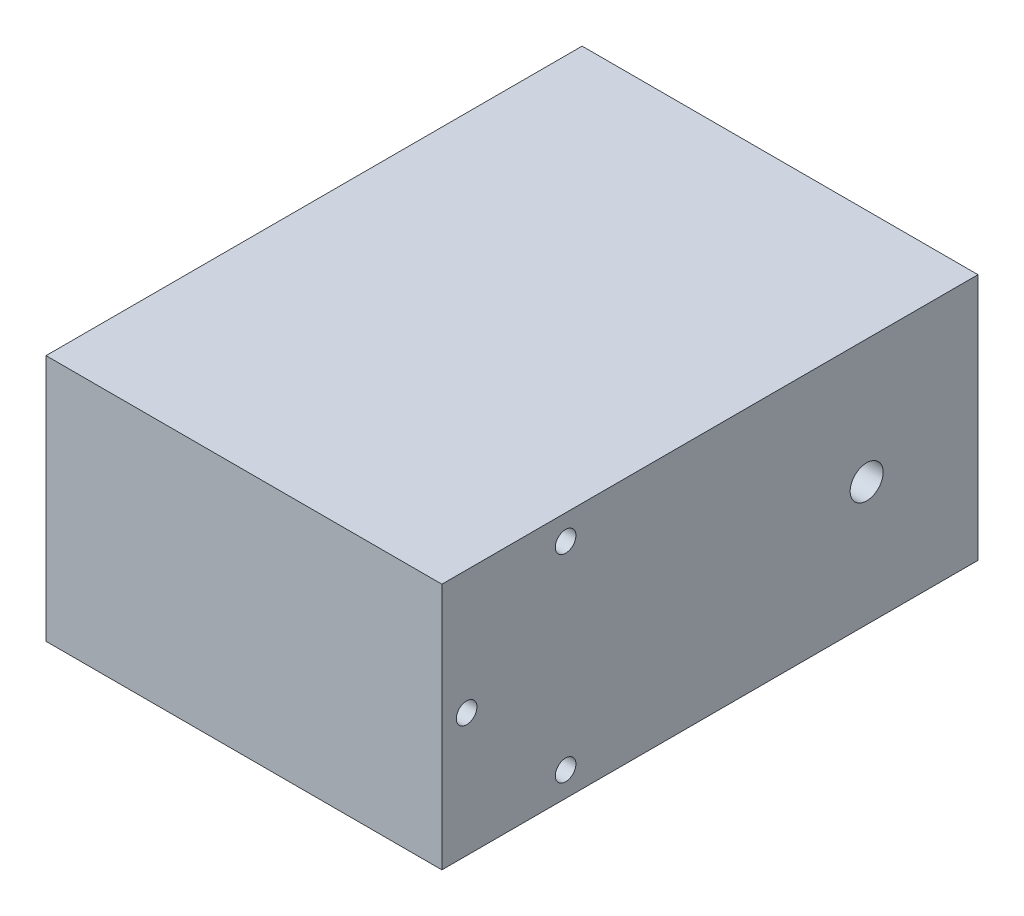
ISO-10303-21;
HEADER;
FILE_DESCRIPTION(('STEP AP214'),'2;1');
FILE_NAME('part.step','',(''),(''),'','','');
FILE_SCHEMA(('AUTOMOTIVE_DESIGN { 1 0 10303 214 1 1 1 1 }'));
ENDSEC;
DATA;
#1=APPLICATION_CONTEXT('core data for automotive mechanical design processes');
#2=APPLICATION_PROTOCOL_DEFINITION('international standard','automotive_design',2000,#1);
#3=PRODUCT_CONTEXT('',#1,'mechanical');
#4=PRODUCT('Part','Part','',(#3));
#5=PRODUCT_RELATED_PRODUCT_CATEGORY('part','',(#4));
#6=PRODUCT_DEFINITION_FORMATION('','',#4);
#7=PRODUCT_DEFINITION_CONTEXT('part definition',#1,'design');
#8=PRODUCT_DEFINITION('design','',#6,#7);
#9=PRODUCT_DEFINITION_SHAPE('','',#8);
#10=(LENGTH_UNIT() NAMED_UNIT(*) SI_UNIT(.MILLI.,.METRE.));
#11=(NAMED_UNIT(*) PLANE_ANGLE_UNIT() SI_UNIT($,.RADIAN.));
#12=(NAMED_UNIT(*) SI_UNIT($,.STERADIAN.) SOLID_ANGLE_UNIT());
#13=UNCERTAINTY_MEASURE_WITH_UNIT(LENGTH_MEASURE(1.E-05),#10,'distance_accuracy_value','');
#14=(GEOMETRIC_REPRESENTATION_CONTEXT(3) GLOBAL_UNCERTAINTY_ASSIGNED_CONTEXT((#13)) GLOBAL_UNIT_ASSIGNED_CONTEXT((#10,
#11,#12)) REPRESENTATION_CONTEXT('',''));
#15=CARTESIAN_POINT('',(0.,0.,0.));
#16=DIRECTION('',(0.,0.,1.));
#17=DIRECTION('',(1.,0.,0.));
#18=AXIS2_PLACEMENT_3D('',#15,#16,#17);
#19=CARTESIAN_POINT('',(48.,0.,0.));
#20=DIRECTION('',(0.,0.,-1.));
#21=DIRECTION('',(0.,1.,0.));
#22=AXIS2_PLACEMENT_3D('',#19,#20,#21);
#23=PLANE('',#22);
#24=DIRECTION('',(0.,-1.,0.));
#25=VECTOR('',#24,1.);
#26=CARTESIAN_POINT('',(0.,0.,0.));
#27=LINE('',#26,#25);
#28=CARTESIAN_POINT('',(0.,30.,0.));
#29=VERTEX_POINT('',#28);
#30=CARTESIAN_POINT('',(0.,0.,0.));
#31=VERTEX_POINT('',#30);
#32=EDGE_CURVE('E80',#29,#31,#27,.T.);
#33=ORIENTED_EDGE('',*,*,#32,.T.);
#34=DIRECTION('',(-1.,0.,0.));
#35=VECTOR('',#34,1.);
#36=CARTESIAN_POINT('',(48.,0.,0.));
#37=LINE('',#36,#35);
#38=CARTESIAN_POINT('',(48.,0.,0.));
#39=VERTEX_POINT('',#38);
#40=EDGE_CURVE('E11',#39,#31,#37,.T.);
#41=ORIENTED_EDGE('',*,*,#40,.F.);
#42=DIRECTION('',(0.,-1.,0.));
#43=VECTOR('',#42,1.);
#44=CARTESIAN_POINT('',(48.,0.,0.));
#45=LINE('',#44,#43);
#46=CARTESIAN_POINT('',(48.,30.,0.));
#47=VERTEX_POINT('',#46);
#48=EDGE_CURVE('E68',#47,#39,#45,.T.);
#49=ORIENTED_EDGE('',*,*,#48,.F.);
#50=DIRECTION('',(-1.,0.,0.));
#51=VECTOR('',#50,1.);
#52=CARTESIAN_POINT('',(48.,30.,0.));
#53=LINE('',#52,#51);
#54=EDGE_CURVE('E76',#47,#29,#53,.T.);
#55=ORIENTED_EDGE('',*,*,#54,.T.);
#56=EDGE_LOOP('',(#33,#41,#49,#55));
#57=FACE_BOUND('',#56,.T.);
#58=ADVANCED_FACE('F17',(#57),#23,.F.);
#59=CARTESIAN_POINT('',(48.,0.,0.));
#60=DIRECTION('',(0.,1.,0.));
#61=DIRECTION('',(0.,0.,1.));
#62=AXIS2_PLACEMENT_3D('',#59,#60,#61);
#63=PLANE('',#62);
#64=DIRECTION('',(0.,0.,-1.));
#65=VECTOR('',#64,1.);
#66=CARTESIAN_POINT('',(0.,0.,0.));
#67=LINE('',#66,#65);
#68=CARTESIAN_POINT('',(0.,0.,-65.));
#69=VERTEX_POINT('',#68);
#70=EDGE_CURVE('E72',#31,#69,#67,.T.);
#71=ORIENTED_EDGE('',*,*,#70,.T.);
#72=DIRECTION('',(-1.,0.,0.));
#73=VECTOR('',#72,1.);
#74=CARTESIAN_POINT('',(48.,0.,-65.));
#75=LINE('',#74,#73);
#76=CARTESIAN_POINT('',(48.,0.,-65.));
#77=VERTEX_POINT('',#76);
#78=EDGE_CURVE('E25',#77,#69,#75,.T.);
#79=ORIENTED_EDGE('',*,*,#78,.F.);
#80=DIRECTION('',(0.,0.,-1.));
#81=VECTOR('',#80,1.);
#82=CARTESIAN_POINT('',(48.,0.,0.));
#83=LINE('',#82,#81);
#84=EDGE_CURVE('E63',#39,#77,#83,.T.);
#85=ORIENTED_EDGE('',*,*,#84,.F.);
#86=ORIENTED_EDGE('',*,*,#40,.T.);
#87=EDGE_LOOP('',(#71,#79,#85,#86));
#88=FACE_BOUND('',#87,.T.);
#89=ADVANCED_FACE('F71',(#88),#63,.F.);
#90=CARTESIAN_POINT('',(48.,0.,-65.));
#91=DIRECTION('',(0.,0.,1.));
#92=DIRECTION('',(0.,-1.,0.));
#93=AXIS2_PLACEMENT_3D('',#90,#91,#92);
#94=PLANE('',#93);
#95=DIRECTION('',(0.,1.,0.));
#96=VECTOR('',#95,1.);
#97=CARTESIAN_POINT('',(0.,0.,-65.));
#98=LINE('',#97,#96);
#99=CARTESIAN_POINT('',(0.,30.,-65.));
#100=VERTEX_POINT('',#99);
#101=EDGE_CURVE('E50',#69,#100,#98,.T.);
#102=ORIENTED_EDGE('',*,*,#101,.T.);
#103=DIRECTION('',(-1.,0.,0.));
#104=VECTOR('',#103,1.);
#105=CARTESIAN_POINT('',(48.,30.,-65.));
#106=LINE('',#105,#104);
#107=CARTESIAN_POINT('',(48.,30.,-65.));
#108=VERTEX_POINT('',#107);
#109=EDGE_CURVE('E73',#108,#100,#106,.T.);
#110=ORIENTED_EDGE('',*,*,#109,.F.);
#111=DIRECTION('',(0.,1.,0.));
#112=VECTOR('',#111,1.);
#113=CARTESIAN_POINT('',(48.,0.,-65.));
#114=LINE('',#113,#112);
#115=EDGE_CURVE('E66',#77,#108,#114,.T.);
#116=ORIENTED_EDGE('',*,*,#115,.F.);
#117=ORIENTED_EDGE('',*,*,#78,.T.);
#118=EDGE_LOOP('',(#102,#110,#116,#117));
#119=FACE_BOUND('',#118,.T.);
#120=ADVANCED_FACE('F74',(#119),#94,.F.);
#121=CARTESIAN_POINT('',(48.,30.,0.));
#122=DIRECTION('',(0.,-1.,0.));
#123=DIRECTION('',(0.,0.,-1.));
#124=AXIS2_PLACEMENT_3D('',#121,#122,#123);
#125=PLANE('',#124);
#126=DIRECTION('',(0.,0.,1.));
#127=VECTOR('',#126,1.);
#128=CARTESIAN_POINT('',(0.,30.,0.));
#129=LINE('',#128,#127);
#130=EDGE_CURVE('E56',#100,#29,#129,.T.);
#131=ORIENTED_EDGE('',*,*,#130,.T.);
#132=ORIENTED_EDGE('',*,*,#54,.F.);
#133=DIRECTION('',(0.,0.,1.));
#134=VECTOR('',#133,1.);
#135=CARTESIAN_POINT('',(48.,30.,0.));
#136=LINE('',#135,#134);
#137=EDGE_CURVE('E33',#108,#47,#136,.T.);
#138=ORIENTED_EDGE('',*,*,#137,.F.);
#139=ORIENTED_EDGE('',*,*,#109,.T.);
#140=EDGE_LOOP('',(#131,#132,#138,#139));
#141=FACE_BOUND('',#140,.T.);
#142=ADVANCED_FACE('F88',(#141),#125,.F.);
#143=CARTESIAN_POINT('',(48.,0.,0.));
#144=DIRECTION('',(-1.,0.,0.));
#145=DIRECTION('',(0.,0.,1.));
#146=AXIS2_PLACEMENT_3D('',#143,#144,#145);
#147=PLANE('',#146);
#148=CARTESIAN_POINT('',(48.,15.,-51.5));
#149=DIRECTION('',(-1.,0.,0.));
#150=DIRECTION('',(0.,0.,1.));
#151=AXIS2_PLACEMENT_3D('',#148,#149,#150);
#152=CIRCLE('',#151,2.);
#153=CARTESIAN_POINT('',(48.,15.,-49.5));
#154=VERTEX_POINT('',#153);
#155=EDGE_CURVE('E122',#154,#154,#152,.T.);
#156=ORIENTED_EDGE('',*,*,#155,.T.);
#157=EDGE_LOOP('',(#156));
#158=FACE_BOUND('',#157,.T.);
#159=CARTESIAN_POINT('',(48.,27.,-15.));
#160=DIRECTION('',(1.,0.,0.));
#161=DIRECTION('',(0.,0.,-1.));
#162=AXIS2_PLACEMENT_3D('',#159,#160,#161);
#163=CIRCLE('',#162,1.25);
#164=CARTESIAN_POINT('',(48.,27.,-16.25));
#165=VERTEX_POINT('',#164);
#166=EDGE_CURVE('E107',#165,#165,#163,.T.);
#167=ORIENTED_EDGE('',*,*,#166,.F.);
#168=EDGE_LOOP('',(#167));
#169=FACE_BOUND('',#168,.T.);
#170=CARTESIAN_POINT('',(48.,15.,-3.));
#171=DIRECTION('',(1.,0.,0.));
#172=DIRECTION('',(0.,0.,-1.));
#173=AXIS2_PLACEMENT_3D('',#170,#171,#172);
#174=CIRCLE('',#173,1.25);
#175=CARTESIAN_POINT('',(48.,15.,-4.25));
#176=VERTEX_POINT('',#175);
#177=EDGE_CURVE('E101',#176,#176,#174,.T.);
#178=ORIENTED_EDGE('',*,*,#177,.F.);
#179=EDGE_LOOP('',(#178));
#180=FACE_BOUND('',#179,.T.);
#181=CARTESIAN_POINT('',(48.,3.,-15.));
#182=DIRECTION('',(1.,0.,0.));
#183=DIRECTION('',(0.,0.,-1.));
#184=AXIS2_PLACEMENT_3D('',#181,#182,#183);
#185=CIRCLE('',#184,1.25);
#186=CARTESIAN_POINT('',(48.,3.,-16.25));
#187=VERTEX_POINT('',#186);
#188=EDGE_CURVE('E94',#187,#187,#185,.T.);
#189=ORIENTED_EDGE('',*,*,#188,.F.);
#190=EDGE_LOOP('',(#189));
#191=FACE_BOUND('',#190,.T.);
#192=ORIENTED_EDGE('',*,*,#48,.T.);
#193=ORIENTED_EDGE('',*,*,#84,.T.);
#194=ORIENTED_EDGE('',*,*,#115,.T.);
#195=ORIENTED_EDGE('',*,*,#137,.T.);
#196=EDGE_LOOP('',(#192,#193,#194,#195));
#197=FACE_BOUND('',#196,.T.);
#198=ADVANCED_FACE('F64',(#158,#169,#180,#191,#197),#147,.F.);
#199=CARTESIAN_POINT('',(0.,0.,0.));
#200=DIRECTION('',(-1.,0.,0.));
#201=DIRECTION('',(0.,0.,1.));
#202=AXIS2_PLACEMENT_3D('',#199,#200,#201);
#203=PLANE('',#202);
#204=CARTESIAN_POINT('',(0.,15.,-51.5));
#205=DIRECTION('',(-1.,0.,0.));
#206=DIRECTION('',(0.,0.,1.));
#207=AXIS2_PLACEMENT_3D('',#204,#205,#206);
#208=CIRCLE('',#207,2.);
#209=CARTESIAN_POINT('',(0.,15.,-49.5));
#210=VERTEX_POINT('',#209);
#211=EDGE_CURVE('E136',#210,#210,#208,.T.);
#212=ORIENTED_EDGE('',*,*,#211,.F.);
#213=EDGE_LOOP('',(#212));
#214=FACE_BOUND('',#213,.T.);
#215=CARTESIAN_POINT('',(0.,27.,-3.00000000000007));
#216=DIRECTION('',(-1.,0.,0.));
#217=DIRECTION('',(0.,0.,1.));
#218=AXIS2_PLACEMENT_3D('',#215,#216,#217);
#219=CIRCLE('',#218,1.25);
#220=CARTESIAN_POINT('',(0.,27.,-1.75000000000007));
#221=VERTEX_POINT('',#220);
#222=EDGE_CURVE('E118',#221,#221,#219,.T.);
#223=ORIENTED_EDGE('',*,*,#222,.F.);
#224=EDGE_LOOP('',(#223));
#225=FACE_BOUND('',#224,.T.);
#226=CARTESIAN_POINT('',(0.,27.,-27.));
#227=DIRECTION('',(-1.,0.,0.));
#228=DIRECTION('',(0.,0.,1.));
#229=AXIS2_PLACEMENT_3D('',#226,#227,#228);
#230=CIRCLE('',#229,1.25);
#231=CARTESIAN_POINT('',(0.,27.,-25.75));
#232=VERTEX_POINT('',#231);
#233=EDGE_CURVE('E125',#232,#232,#230,.T.);
#234=ORIENTED_EDGE('',*,*,#233,.F.);
#235=EDGE_LOOP('',(#234));
#236=FACE_BOUND('',#235,.T.);
#237=CARTESIAN_POINT('',(0.,2.99999999999983,-27.));
#238=DIRECTION('',(-1.,0.,0.));
#239=DIRECTION('',(0.,0.,1.));
#240=AXIS2_PLACEMENT_3D('',#237,#238,#239);
#241=CIRCLE('',#240,1.25);
#242=CARTESIAN_POINT('',(0.,2.99999999999983,-25.75));
#243=VERTEX_POINT('',#242);
#244=EDGE_CURVE('E131',#243,#243,#241,.T.);
#245=ORIENTED_EDGE('',*,*,#244,.F.);
#246=EDGE_LOOP('',(#245));
#247=FACE_BOUND('',#246,.T.);
#248=CARTESIAN_POINT('',(0.,3.,-3.));
#249=DIRECTION('',(-1.,0.,0.));
#250=DIRECTION('',(0.,0.,1.));
#251=AXIS2_PLACEMENT_3D('',#248,#249,#250);
#252=CIRCLE('',#251,1.25);
#253=CARTESIAN_POINT('',(0.,3.,-1.75));
#254=VERTEX_POINT('',#253);
#255=EDGE_CURVE('E112',#254,#254,#252,.T.);
#256=ORIENTED_EDGE('',*,*,#255,.F.);
#257=EDGE_LOOP('',(#256));
#258=FACE_BOUND('',#257,.T.);
#259=ORIENTED_EDGE('',*,*,#32,.F.);
#260=ORIENTED_EDGE('',*,*,#130,.F.);
#261=ORIENTED_EDGE('',*,*,#101,.F.);
#262=ORIENTED_EDGE('',*,*,#70,.F.);
#263=EDGE_LOOP('',(#259,#260,#261,#262));
#264=FACE_BOUND('',#263,.T.);
#265=ADVANCED_FACE('F91',(#214,#225,#236,#247,#258,#264),#203,.T.);
#266=CARTESIAN_POINT('',(43.,3.,-15.));
#267=DIRECTION('',(1.,0.,0.));
#268=DIRECTION('',(0.,0.,-1.));
#269=AXIS2_PLACEMENT_3D('',#266,#267,#268);
#270=CYLINDRICAL_SURFACE('',#269,1.25);
#271=CARTESIAN_POINT('',(43.,3.,-15.));
#272=DIRECTION('',(1.,0.,0.));
#273=DIRECTION('',(0.,0.,-1.));
#274=AXIS2_PLACEMENT_3D('',#271,#272,#273);
#275=CIRCLE('',#274,1.25);
#276=CARTESIAN_POINT('',(43.,3.,-16.25));
#277=VERTEX_POINT('',#276);
#278=EDGE_CURVE('E97',#277,#277,#275,.T.);
#279=ORIENTED_EDGE('',*,*,#278,.F.);
#280=EDGE_LOOP('',(#279));
#281=FACE_BOUND('',#280,.T.);
#282=ORIENTED_EDGE('',*,*,#188,.T.);
#283=EDGE_LOOP('',(#282));
#284=FACE_BOUND('',#283,.T.);
#285=ADVANCED_FACE('F153',(#281,#284),#270,.F.);
#286=CARTESIAN_POINT('',(43.,3.,-15.));
#287=DIRECTION('',(1.,0.,0.));
#288=DIRECTION('',(0.,0.,-1.));
#289=AXIS2_PLACEMENT_3D('',#286,#287,#288);
#290=PLANE('',#289);
#291=ORIENTED_EDGE('',*,*,#278,.T.);
#292=EDGE_LOOP('',(#291));
#293=FACE_BOUND('',#292,.T.);
#294=ADVANCED_FACE('F199',(#293),#290,.T.);
#295=CARTESIAN_POINT('',(43.,15.,-3.));
#296=DIRECTION('',(1.,0.,0.));
#297=DIRECTION('',(0.,0.,-1.));
#298=AXIS2_PLACEMENT_3D('',#295,#296,#297);
#299=CYLINDRICAL_SURFACE('',#298,1.25);
#300=CARTESIAN_POINT('',(43.,15.,-3.));
#301=DIRECTION('',(1.,0.,0.));
#302=DIRECTION('',(0.,0.,-1.));
#303=AXIS2_PLACEMENT_3D('',#300,#301,#302);
#304=CIRCLE('',#303,1.25);
#305=CARTESIAN_POINT('',(43.,15.,-4.25));
#306=VERTEX_POINT('',#305);
#307=EDGE_CURVE('E104',#306,#306,#304,.T.);
#308=ORIENTED_EDGE('',*,*,#307,.F.);
#309=EDGE_LOOP('',(#308));
#310=FACE_BOUND('',#309,.T.);
#311=ORIENTED_EDGE('',*,*,#177,.T.);
#312=EDGE_LOOP('',(#311));
#313=FACE_BOUND('',#312,.T.);
#314=ADVANCED_FACE('F203',(#310,#313),#299,.F.);
#315=CARTESIAN_POINT('',(43.,15.,-3.));
#316=DIRECTION('',(1.,0.,0.));
#317=DIRECTION('',(0.,0.,-1.));
#318=AXIS2_PLACEMENT_3D('',#315,#316,#317);
#319=PLANE('',#318);
#320=ORIENTED_EDGE('',*,*,#307,.T.);
#321=EDGE_LOOP('',(#320));
#322=FACE_BOUND('',#321,.T.);
#323=ADVANCED_FACE('F207',(#322),#319,.T.);
#324=CARTESIAN_POINT('',(43.,27.,-15.));
#325=DIRECTION('',(1.,0.,0.));
#326=DIRECTION('',(0.,0.,-1.));
#327=AXIS2_PLACEMENT_3D('',#324,#325,#326);
#328=CYLINDRICAL_SURFACE('',#327,1.25);
#329=CARTESIAN_POINT('',(43.,27.,-15.));
#330=DIRECTION('',(1.,0.,0.));
#331=DIRECTION('',(0.,0.,-1.));
#332=AXIS2_PLACEMENT_3D('',#329,#330,#331);
#333=CIRCLE('',#332,1.25);
#334=CARTESIAN_POINT('',(43.,27.,-16.25));
#335=VERTEX_POINT('',#334);
#336=EDGE_CURVE('E83',#335,#335,#333,.T.);
#337=ORIENTED_EDGE('',*,*,#336,.F.);
#338=EDGE_LOOP('',(#337));
#339=FACE_BOUND('',#338,.T.);
#340=ORIENTED_EDGE('',*,*,#166,.T.);
#341=EDGE_LOOP('',(#340));
#342=FACE_BOUND('',#341,.T.);
#343=ADVANCED_FACE('F178',(#339,#342),#328,.F.);
#344=CARTESIAN_POINT('',(43.,27.,-15.));
#345=DIRECTION('',(1.,0.,0.));
#346=DIRECTION('',(0.,0.,-1.));
#347=AXIS2_PLACEMENT_3D('',#344,#345,#346);
#348=PLANE('',#347);
#349=ORIENTED_EDGE('',*,*,#336,.T.);
#350=EDGE_LOOP('',(#349));
#351=FACE_BOUND('',#350,.T.);
#352=ADVANCED_FACE('F166',(#351),#348,.T.);
#353=CARTESIAN_POINT('',(5.,3.,-3.));
#354=DIRECTION('',(-1.,0.,0.));
#355=DIRECTION('',(0.,0.,1.));
#356=AXIS2_PLACEMENT_3D('',#353,#354,#355);
#357=CYLINDRICAL_SURFACE('',#356,1.25);
#358=CARTESIAN_POINT('',(5.,3.,-3.));
#359=DIRECTION('',(-1.,0.,0.));
#360=DIRECTION('',(0.,0.,1.));
#361=AXIS2_PLACEMENT_3D('',#358,#359,#360);
#362=CIRCLE('',#361,1.25);
#363=CARTESIAN_POINT('',(5.,3.,-1.75));
#364=VERTEX_POINT('',#363);
#365=EDGE_CURVE('E98',#364,#364,#362,.T.);
#366=ORIENTED_EDGE('',*,*,#365,.F.);
#367=EDGE_LOOP('',(#366));
#368=FACE_BOUND('',#367,.T.);
#369=ORIENTED_EDGE('',*,*,#255,.T.);
#370=EDGE_LOOP('',(#369));
#371=FACE_BOUND('',#370,.T.);
#372=ADVANCED_FACE('F163',(#368,#371),#357,.F.);
#373=CARTESIAN_POINT('',(5.,3.,-3.));
#374=DIRECTION('',(-1.,0.,0.));
#375=DIRECTION('',(0.,0.,1.));
#376=AXIS2_PLACEMENT_3D('',#373,#374,#375);
#377=PLANE('',#376);
#378=ORIENTED_EDGE('',*,*,#365,.T.);
#379=EDGE_LOOP('',(#378));
#380=FACE_BOUND('',#379,.T.);
#381=ADVANCED_FACE('F165',(#380),#377,.T.);
#382=CARTESIAN_POINT('',(5.,2.99999999999983,-27.));
#383=DIRECTION('',(-1.,0.,0.));
#384=DIRECTION('',(0.,0.,1.));
#385=AXIS2_PLACEMENT_3D('',#382,#383,#384);
#386=CYLINDRICAL_SURFACE('',#385,1.25);
#387=CARTESIAN_POINT('',(5.,2.99999999999983,-27.));
#388=DIRECTION('',(-1.,0.,0.));
#389=DIRECTION('',(0.,0.,1.));
#390=AXIS2_PLACEMENT_3D('',#387,#388,#389);
#391=CIRCLE('',#390,1.25);
#392=CARTESIAN_POINT('',(5.,2.99999999999983,-25.75));
#393=VERTEX_POINT('',#392);
#394=EDGE_CURVE('E115',#393,#393,#391,.T.);
#395=ORIENTED_EDGE('',*,*,#394,.F.);
#396=EDGE_LOOP('',(#395));
#397=FACE_BOUND('',#396,.T.);
#398=ORIENTED_EDGE('',*,*,#244,.T.);
#399=EDGE_LOOP('',(#398));
#400=FACE_BOUND('',#399,.T.);
#401=ADVANCED_FACE('F175',(#397,#400),#386,.F.);
#402=CARTESIAN_POINT('',(5.,2.99999999999983,-27.));
#403=DIRECTION('',(-1.,0.,0.));
#404=DIRECTION('',(0.,0.,1.));
#405=AXIS2_PLACEMENT_3D('',#402,#403,#404);
#406=PLANE('',#405);
#407=ORIENTED_EDGE('',*,*,#394,.T.);
#408=EDGE_LOOP('',(#407));
#409=FACE_BOUND('',#408,.T.);
#410=ADVANCED_FACE('F258',(#409),#406,.T.);
#411=CARTESIAN_POINT('',(5.,27.,-27.));
#412=DIRECTION('',(-1.,0.,0.));
#413=DIRECTION('',(0.,0.,1.));
#414=AXIS2_PLACEMENT_3D('',#411,#412,#413);
#415=CYLINDRICAL_SURFACE('',#414,1.25);
#416=CARTESIAN_POINT('',(5.,27.,-27.));
#417=DIRECTION('',(-1.,0.,0.));
#418=DIRECTION('',(0.,0.,1.));
#419=AXIS2_PLACEMENT_3D('',#416,#417,#418);
#420=CIRCLE('',#419,1.25);
#421=CARTESIAN_POINT('',(5.,27.,-25.75));
#422=VERTEX_POINT('',#421);
#423=EDGE_CURVE('E128',#422,#422,#420,.T.);
#424=ORIENTED_EDGE('',*,*,#423,.F.);
#425=EDGE_LOOP('',(#424));
#426=FACE_BOUND('',#425,.T.);
#427=ORIENTED_EDGE('',*,*,#233,.T.);
#428=EDGE_LOOP('',(#427));
#429=FACE_BOUND('',#428,.T.);
#430=ADVANCED_FACE('F268',(#426,#429),#415,.F.);
#431=CARTESIAN_POINT('',(5.,27.,-27.));
#432=DIRECTION('',(-1.,0.,0.));
#433=DIRECTION('',(0.,0.,1.));
#434=AXIS2_PLACEMENT_3D('',#431,#432,#433);
#435=PLANE('',#434);
#436=ORIENTED_EDGE('',*,*,#423,.T.);
#437=EDGE_LOOP('',(#436));
#438=FACE_BOUND('',#437,.T.);
#439=ADVANCED_FACE('F278',(#438),#435,.T.);
#440=CARTESIAN_POINT('',(5.,27.,-3.00000000000007));
#441=DIRECTION('',(-1.,0.,0.));
#442=DIRECTION('',(0.,0.,1.));
#443=AXIS2_PLACEMENT_3D('',#440,#441,#442);
#444=CYLINDRICAL_SURFACE('',#443,1.25);
#445=CARTESIAN_POINT('',(5.,27.,-3.00000000000007));
#446=DIRECTION('',(-1.,0.,0.));
#447=DIRECTION('',(0.,0.,1.));
#448=AXIS2_PLACEMENT_3D('',#445,#446,#447);
#449=CIRCLE('',#448,1.25);
#450=CARTESIAN_POINT('',(5.,27.,-1.75000000000007));
#451=VERTEX_POINT('',#450);
#452=EDGE_CURVE('E121',#451,#451,#449,.T.);
#453=ORIENTED_EDGE('',*,*,#452,.F.);
#454=EDGE_LOOP('',(#453));
#455=FACE_BOUND('',#454,.T.);
#456=ORIENTED_EDGE('',*,*,#222,.T.);
#457=EDGE_LOOP('',(#456));
#458=FACE_BOUND('',#457,.T.);
#459=ADVANCED_FACE('F288',(#455,#458),#444,.F.);
#460=CARTESIAN_POINT('',(5.,27.,-3.00000000000007));
#461=DIRECTION('',(-1.,0.,0.));
#462=DIRECTION('',(0.,0.,1.));
#463=AXIS2_PLACEMENT_3D('',#460,#461,#462);
#464=PLANE('',#463);
#465=ORIENTED_EDGE('',*,*,#452,.T.);
#466=EDGE_LOOP('',(#465));
#467=FACE_BOUND('',#466,.T.);
#468=ADVANCED_FACE('F147',(#467),#464,.T.);
#469=CARTESIAN_POINT('',(48.,15.,-51.5));
#470=DIRECTION('',(-1.,0.,0.));
#471=DIRECTION('',(0.,0.,1.));
#472=AXIS2_PLACEMENT_3D('',#469,#470,#471);
#473=CYLINDRICAL_SURFACE('',#472,2.);
#474=ORIENTED_EDGE('',*,*,#155,.F.);
#475=EDGE_LOOP('',(#474));
#476=FACE_BOUND('',#475,.T.);
#477=ORIENTED_EDGE('',*,*,#211,.T.);
#478=EDGE_LOOP('',(#477));
#479=FACE_BOUND('',#478,.T.);
#480=ADVANCED_FACE('F144',(#476,#479),#473,.F.);
#481=CLOSED_SHELL('',(#58,#89,#120,#142,#198,#265,#285,#294,#314,#323,#343,#352,#372,#381,#401,
#410,#430,#439,#459,#468,#480));
#482=MANIFOLD_SOLID_BREP('B1',#481);
#483=ADVANCED_BREP_SHAPE_REPRESENTATION('',(#18,#482),#14);
#484=SHAPE_DEFINITION_REPRESENTATION(#9,#483);
ENDSEC;
END-ISO-10303-21;
